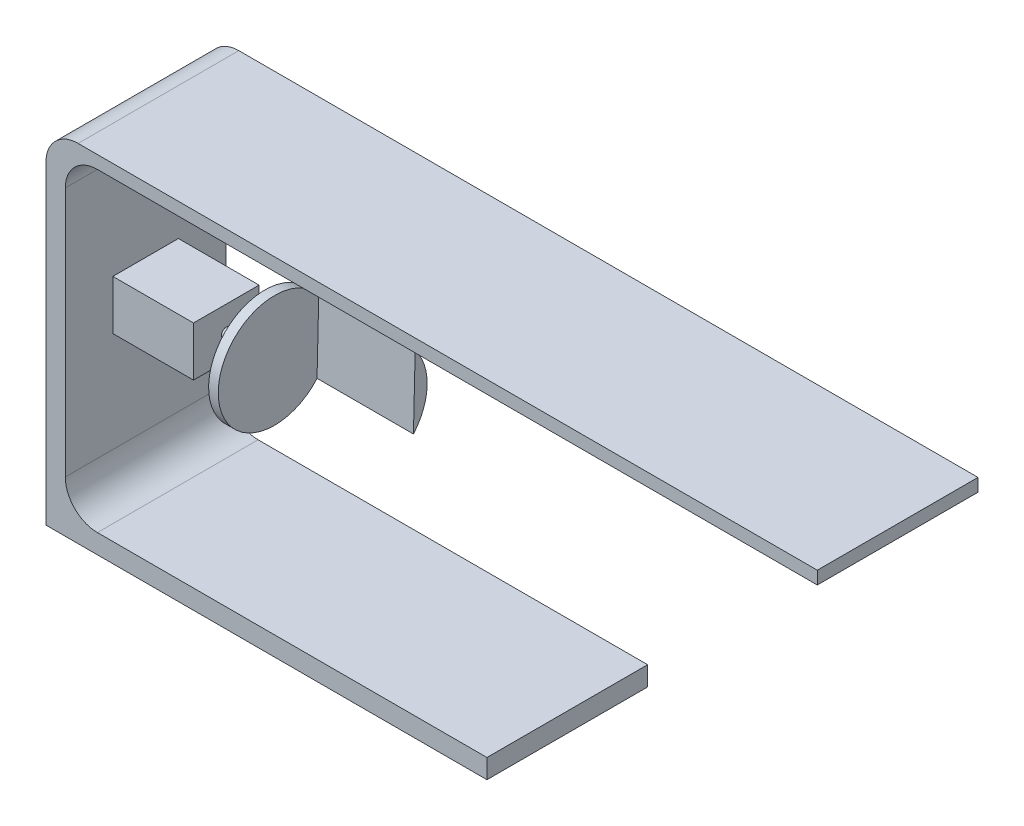
ISO-10303-21;
HEADER;
FILE_DESCRIPTION(('STEP AP214'),'2;1');
FILE_NAME('part.step','',(''),(''),'','','');
FILE_SCHEMA(('AUTOMOTIVE_DESIGN { 1 0 10303 214 1 1 1 1 }'));
ENDSEC;
DATA;
#1=APPLICATION_CONTEXT('core data for automotive mechanical design processes');
#2=APPLICATION_PROTOCOL_DEFINITION('international standard','automotive_design',2000,#1);
#3=PRODUCT_CONTEXT('',#1,'mechanical');
#4=PRODUCT('Part','Part','',(#3));
#5=PRODUCT_RELATED_PRODUCT_CATEGORY('part','',(#4));
#6=PRODUCT_DEFINITION_FORMATION('','',#4);
#7=PRODUCT_DEFINITION_CONTEXT('part definition',#1,'design');
#8=PRODUCT_DEFINITION('design','',#6,#7);
#9=PRODUCT_DEFINITION_SHAPE('','',#8);
#10=(LENGTH_UNIT() NAMED_UNIT(*) SI_UNIT(.MILLI.,.METRE.));
#11=(NAMED_UNIT(*) PLANE_ANGLE_UNIT() SI_UNIT($,.RADIAN.));
#12=(NAMED_UNIT(*) SI_UNIT($,.STERADIAN.) SOLID_ANGLE_UNIT());
#13=UNCERTAINTY_MEASURE_WITH_UNIT(LENGTH_MEASURE(1.E-05),#10,'distance_accuracy_value','');
#14=(GEOMETRIC_REPRESENTATION_CONTEXT(3) GLOBAL_UNCERTAINTY_ASSIGNED_CONTEXT((#13)) GLOBAL_UNIT_ASSIGNED_CONTEXT((#10,
#11,#12)) REPRESENTATION_CONTEXT('',''));
#15=CARTESIAN_POINT('',(0.,0.,0.));
#16=DIRECTION('',(0.,0.,1.));
#17=DIRECTION('',(1.,0.,0.));
#18=AXIS2_PLACEMENT_3D('',#15,#16,#17);
#19=CARTESIAN_POINT('',(-94.1052027599783,-52.9338808323686,0.));
#20=DIRECTION('',(-1.,0.,0.));
#21=DIRECTION('',(0.,0.,1.));
#22=AXIS2_PLACEMENT_3D('',#19,#20,#21);
#23=CYLINDRICAL_SURFACE('',#22,1.5);
#24=CARTESIAN_POINT('',(-94.1052027599783,-52.9338808323686,0.));
#25=DIRECTION('',(1.,0.,0.));
#26=DIRECTION('',(0.,0.,-1.));
#27=AXIS2_PLACEMENT_3D('',#24,#25,#26);
#28=CIRCLE('',#27,1.5);
#29=CARTESIAN_POINT('',(-94.1052027599783,-52.9338808323686,-1.50000000000001));
#30=VERTEX_POINT('',#29);
#31=EDGE_CURVE('E12',#30,#30,#28,.T.);
#32=ORIENTED_EDGE('',*,*,#31,.F.);
#33=EDGE_LOOP('',(#32));
#34=FACE_BOUND('',#33,.T.);
#35=CARTESIAN_POINT('',(-106.105202759978,-52.9338808323686,0.));
#36=DIRECTION('',(1.,0.,0.));
#37=DIRECTION('',(0.,0.,-1.));
#38=AXIS2_PLACEMENT_3D('',#35,#36,#37);
#39=CIRCLE('',#38,1.5);
#40=CARTESIAN_POINT('',(-106.105202759978,-52.9338808323686,-1.50000000000001));
#41=VERTEX_POINT('',#40);
#42=EDGE_CURVE('E59',#41,#41,#39,.T.);
#43=ORIENTED_EDGE('',*,*,#42,.T.);
#44=EDGE_LOOP('',(#43));
#45=FACE_BOUND('',#44,.T.);
#46=ADVANCED_FACE('F56',(#34,#45),#23,.T.);
#47=CARTESIAN_POINT('',(-106.105202759978,-52.9338808323686,0.));
#48=DIRECTION('',(1.,0.,0.));
#49=DIRECTION('',(0.,0.,-1.));
#50=AXIS2_PLACEMENT_3D('',#47,#48,#49);
#51=PLANE('',#50);
#52=ORIENTED_EDGE('',*,*,#42,.F.);
#53=EDGE_LOOP('',(#52));
#54=FACE_BOUND('',#53,.T.);
#55=ADVANCED_FACE('F120',(#54),#51,.F.);
#56=CARTESIAN_POINT('',(-91.1052027599783,-52.9338808323686,0.));
#57=DIRECTION('',(-1.,0.,0.));
#58=DIRECTION('',(0.,0.,1.));
#59=AXIS2_PLACEMENT_3D('',#56,#57,#58);
#60=CYLINDRICAL_SURFACE('',#59,17.5);
#61=CARTESIAN_POINT('',(-91.1052027599783,-52.9338808323686,0.));
#62=DIRECTION('',(1.,0.,0.));
#63=DIRECTION('',(0.,0.,-1.));
#64=AXIS2_PLACEMENT_3D('',#61,#62,#63);
#65=CIRCLE('',#64,17.5);
#66=CARTESIAN_POINT('',(-91.1052027599783,-42.1329352288658,-13.7691529902958));
#67=VERTEX_POINT('',#66);
#68=CARTESIAN_POINT('',(-91.1052027599783,-64.3806688645096,-13.237108587121));
#69=VERTEX_POINT('',#68);
#70=EDGE_CURVE('E81',#67,#69,#65,.T.);
#71=ORIENTED_EDGE('',*,*,#70,.F.);
#72=DIRECTION('',(-1.,0.,0.));
#73=VECTOR('',#72,1.);
#74=CARTESIAN_POINT('',(-61.1052027599783,-42.1329352288658,-13.7691529902958));
#75=LINE('',#74,#73);
#76=CARTESIAN_POINT('',(-61.1052027599783,-42.1329352288658,-13.7691529902958));
#77=VERTEX_POINT('',#76);
#78=EDGE_CURVE('E93',#77,#67,#75,.T.);
#79=ORIENTED_EDGE('',*,*,#78,.F.);
#80=CARTESIAN_POINT('',(-61.1052027599783,-52.9338808323686,0.));
#81=DIRECTION('',(1.,0.,0.));
#82=DIRECTION('',(0.,0.,-1.));
#83=AXIS2_PLACEMENT_3D('',#80,#81,#82);
#84=CIRCLE('',#83,17.5);
#85=CARTESIAN_POINT('',(-61.1052027599783,-64.3806688645096,-13.237108587121));
#86=VERTEX_POINT('',#85);
#87=EDGE_CURVE('E94',#86,#77,#84,.T.);
#88=ORIENTED_EDGE('',*,*,#87,.F.);
#89=DIRECTION('',(-1.,0.,0.));
#90=VECTOR('',#89,1.);
#91=CARTESIAN_POINT('',(-61.1052027599783,-64.3806688645096,-13.237108587121));
#92=LINE('',#91,#90);
#93=EDGE_CURVE('E91',#86,#69,#92,.T.);
#94=ORIENTED_EDGE('',*,*,#93,.T.);
#95=EDGE_LOOP('',(#71,#79,#88,#94));
#96=FACE_BOUND('',#95,.T.);
#97=CARTESIAN_POINT('',(-94.1052027599783,-52.9338808323686,0.));
#98=DIRECTION('',(1.,0.,0.));
#99=DIRECTION('',(0.,0.,-1.));
#100=AXIS2_PLACEMENT_3D('',#97,#98,#99);
#101=CIRCLE('',#100,17.5);
#102=CARTESIAN_POINT('',(-94.1052027599783,-52.9338808323686,-17.5));
#103=VERTEX_POINT('',#102);
#104=EDGE_CURVE('E87',#103,#103,#101,.T.);
#105=ORIENTED_EDGE('',*,*,#104,.T.);
#106=EDGE_LOOP('',(#105));
#107=FACE_BOUND('',#106,.T.);
#108=ADVANCED_FACE('F96',(#96,#107),#60,.T.);
#109=CARTESIAN_POINT('',(-91.1052027599783,-52.9338808323686,0.));
#110=DIRECTION('',(1.,0.,0.));
#111=DIRECTION('',(0.,0.,-1.));
#112=AXIS2_PLACEMENT_3D('',#109,#110,#111);
#113=PLANE('',#112);
#114=DIRECTION('',(0.,-0.999714169889521,0.0239077084243809));
#115=VECTOR('',#114,1.);
#116=CARTESIAN_POINT('',(-91.1052027599783,-42.1329352288658,-13.7691529902958));
#117=LINE('',#116,#115);
#118=EDGE_CURVE('E69',#67,#69,#117,.T.);
#119=ORIENTED_EDGE('',*,*,#118,.F.);
#120=ORIENTED_EDGE('',*,*,#70,.T.);
#121=EDGE_LOOP('',(#119,#120));
#122=FACE_BOUND('',#121,.T.);
#123=ADVANCED_FACE('F82',(#122),#113,.T.);
#124=CARTESIAN_POINT('',(-94.1052027599783,-52.9338808323686,0.));
#125=DIRECTION('',(1.,0.,0.));
#126=DIRECTION('',(0.,0.,-1.));
#127=AXIS2_PLACEMENT_3D('',#124,#125,#126);
#128=PLANE('',#127);
#129=ORIENTED_EDGE('',*,*,#31,.T.);
#130=EDGE_LOOP('',(#129));
#131=FACE_BOUND('',#130,.T.);
#132=ORIENTED_EDGE('',*,*,#104,.F.);
#133=EDGE_LOOP('',(#132));
#134=FACE_BOUND('',#133,.T.);
#135=ADVANCED_FACE('F105',(#131,#134),#128,.F.);
#136=CARTESIAN_POINT('',(-61.1052027599783,-42.1329352288658,-13.7691529902958));
#137=DIRECTION('',(0.,-0.0239077084243809,-0.999714169889521));
#138=DIRECTION('',(0.,0.999714169889521,-0.0239077084243809));
#139=AXIS2_PLACEMENT_3D('',#136,#137,#138);
#140=PLANE('',#139);
#141=ORIENTED_EDGE('',*,*,#118,.T.);
#142=ORIENTED_EDGE('',*,*,#93,.F.);
#143=DIRECTION('',(0.,-0.999714169889521,0.0239077084243809));
#144=VECTOR('',#143,1.);
#145=CARTESIAN_POINT('',(-61.1052027599783,-42.1329352288658,-13.7691529902958));
#146=LINE('',#145,#144);
#147=EDGE_CURVE('E77',#77,#86,#146,.T.);
#148=ORIENTED_EDGE('',*,*,#147,.F.);
#149=ORIENTED_EDGE('',*,*,#78,.T.);
#150=EDGE_LOOP('',(#141,#142,#148,#149));
#151=FACE_BOUND('',#150,.T.);
#152=ADVANCED_FACE('F90',(#151),#140,.F.);
#153=CARTESIAN_POINT('',(-61.1052027599783,-52.9338808323686,0.));
#154=DIRECTION('',(1.,0.,0.));
#155=DIRECTION('',(0.,0.,-1.));
#156=AXIS2_PLACEMENT_3D('',#153,#154,#155);
#157=PLANE('',#156);
#158=ORIENTED_EDGE('',*,*,#87,.T.);
#159=ORIENTED_EDGE('',*,*,#147,.T.);
#160=EDGE_LOOP('',(#158,#159));
#161=FACE_BOUND('',#160,.T.);
#162=ADVANCED_FACE('F114',(#161),#157,.T.);
#163=CLOSED_SHELL('',(#46,#55,#108,#123,#135,#152,#162));
#164=MANIFOLD_SOLID_BREP('B2',#163);
#165=CARTESIAN_POINT('',(-106.105202759978,-60.6338808323686,-10.2));
#166=DIRECTION('',(0.,0.,1.));
#167=DIRECTION('',(1.,0.,0.));
#168=AXIS2_PLACEMENT_3D('',#165,#166,#167);
#169=PLANE('',#168);
#170=DIRECTION('',(0.,1.,0.));
#171=VECTOR('',#170,1.);
#172=CARTESIAN_POINT('',(-131.205202759978,-60.6338808323686,-10.2));
#173=LINE('',#172,#171);
#174=CARTESIAN_POINT('',(-131.205202759978,-60.6338808323686,-10.2));
#175=VERTEX_POINT('',#174);
#176=CARTESIAN_POINT('',(-131.205202759978,-45.2338808323686,-10.2));
#177=VERTEX_POINT('',#176);
#178=EDGE_CURVE('E248',#175,#177,#173,.T.);
#179=ORIENTED_EDGE('',*,*,#178,.T.);
#180=DIRECTION('',(-1.,0.,0.));
#181=VECTOR('',#180,1.);
#182=CARTESIAN_POINT('',(-106.105202759978,-45.2338808323686,-10.2));
#183=LINE('',#182,#181);
#184=CARTESIAN_POINT('',(-106.105202759978,-45.2338808323686,-10.2));
#185=VERTEX_POINT('',#184);
#186=EDGE_CURVE('E54',#185,#177,#183,.T.);
#187=ORIENTED_EDGE('',*,*,#186,.F.);
#188=DIRECTION('',(0.,1.,0.));
#189=VECTOR('',#188,1.);
#190=CARTESIAN_POINT('',(-106.105202759978,-60.6338808323686,-10.2));
#191=LINE('',#190,#189);
#192=CARTESIAN_POINT('',(-106.105202759978,-60.6338808323686,-10.2));
#193=VERTEX_POINT('',#192);
#194=EDGE_CURVE('E236',#193,#185,#191,.T.);
#195=ORIENTED_EDGE('',*,*,#194,.F.);
#196=DIRECTION('',(-1.,0.,0.));
#197=VECTOR('',#196,1.);
#198=CARTESIAN_POINT('',(-106.105202759978,-60.6338808323686,-10.2));
#199=LINE('',#198,#197);
#200=EDGE_CURVE('E244',#193,#175,#199,.T.);
#201=ORIENTED_EDGE('',*,*,#200,.T.);
#202=EDGE_LOOP('',(#179,#187,#195,#201));
#203=FACE_BOUND('',#202,.T.);
#204=ADVANCED_FACE('F185',(#203),#169,.F.);
#205=CARTESIAN_POINT('',(-106.105202759978,-45.2338808323686,10.2));
#206=DIRECTION('',(0.,-1.,0.));
#207=DIRECTION('',(0.,0.,-1.));
#208=AXIS2_PLACEMENT_3D('',#205,#206,#207);
#209=PLANE('',#208);
#210=DIRECTION('',(0.,0.,1.));
#211=VECTOR('',#210,1.);
#212=CARTESIAN_POINT('',(-131.205202759978,-45.2338808323686,10.2));
#213=LINE('',#212,#211);
#214=CARTESIAN_POINT('',(-131.205202759978,-45.2338808323686,10.2));
#215=VERTEX_POINT('',#214);
#216=EDGE_CURVE('E240',#177,#215,#213,.T.);
#217=ORIENTED_EDGE('',*,*,#216,.T.);
#218=DIRECTION('',(-1.,0.,0.));
#219=VECTOR('',#218,1.);
#220=CARTESIAN_POINT('',(-106.105202759978,-45.2338808323686,10.2));
#221=LINE('',#220,#219);
#222=CARTESIAN_POINT('',(-106.105202759978,-45.2338808323686,10.2));
#223=VERTEX_POINT('',#222);
#224=EDGE_CURVE('E193',#223,#215,#221,.T.);
#225=ORIENTED_EDGE('',*,*,#224,.F.);
#226=DIRECTION('',(0.,0.,1.));
#227=VECTOR('',#226,1.);
#228=CARTESIAN_POINT('',(-106.105202759978,-45.2338808323686,10.2));
#229=LINE('',#228,#227);
#230=EDGE_CURVE('E231',#185,#223,#229,.T.);
#231=ORIENTED_EDGE('',*,*,#230,.F.);
#232=ORIENTED_EDGE('',*,*,#186,.T.);
#233=EDGE_LOOP('',(#217,#225,#231,#232));
#234=FACE_BOUND('',#233,.T.);
#235=ADVANCED_FACE('F239',(#234),#209,.F.);
#236=CARTESIAN_POINT('',(-106.105202759978,-60.6338808323686,10.2));
#237=DIRECTION('',(0.,0.,-1.));
#238=DIRECTION('',(-1.,0.,0.));
#239=AXIS2_PLACEMENT_3D('',#236,#237,#238);
#240=PLANE('',#239);
#241=DIRECTION('',(0.,-1.,0.));
#242=VECTOR('',#241,1.);
#243=CARTESIAN_POINT('',(-131.205202759978,-60.6338808323686,10.2));
#244=LINE('',#243,#242);
#245=CARTESIAN_POINT('',(-131.205202759978,-60.6338808323686,10.2));
#246=VERTEX_POINT('',#245);
#247=EDGE_CURVE('E218',#215,#246,#244,.T.);
#248=ORIENTED_EDGE('',*,*,#247,.T.);
#249=DIRECTION('',(-1.,0.,0.));
#250=VECTOR('',#249,1.);
#251=CARTESIAN_POINT('',(-106.105202759978,-60.6338808323686,10.2));
#252=LINE('',#251,#250);
#253=CARTESIAN_POINT('',(-106.105202759978,-60.6338808323686,10.2));
#254=VERTEX_POINT('',#253);
#255=EDGE_CURVE('E241',#254,#246,#252,.T.);
#256=ORIENTED_EDGE('',*,*,#255,.F.);
#257=DIRECTION('',(0.,-1.,0.));
#258=VECTOR('',#257,1.);
#259=CARTESIAN_POINT('',(-106.105202759978,-60.6338808323686,10.2));
#260=LINE('',#259,#258);
#261=EDGE_CURVE('E234',#223,#254,#260,.T.);
#262=ORIENTED_EDGE('',*,*,#261,.F.);
#263=ORIENTED_EDGE('',*,*,#224,.T.);
#264=EDGE_LOOP('',(#248,#256,#262,#263));
#265=FACE_BOUND('',#264,.T.);
#266=ADVANCED_FACE('F242',(#265),#240,.F.);
#267=CARTESIAN_POINT('',(-106.105202759978,-60.6338808323686,10.2));
#268=DIRECTION('',(0.,1.,0.));
#269=DIRECTION('',(0.,0.,1.));
#270=AXIS2_PLACEMENT_3D('',#267,#268,#269);
#271=PLANE('',#270);
#272=DIRECTION('',(0.,0.,-1.));
#273=VECTOR('',#272,1.);
#274=CARTESIAN_POINT('',(-131.205202759978,-60.6338808323686,10.2));
#275=LINE('',#274,#273);
#276=EDGE_CURVE('E224',#246,#175,#275,.T.);
#277=ORIENTED_EDGE('',*,*,#276,.T.);
#278=ORIENTED_EDGE('',*,*,#200,.F.);
#279=DIRECTION('',(0.,0.,-1.));
#280=VECTOR('',#279,1.);
#281=CARTESIAN_POINT('',(-106.105202759978,-60.6338808323686,10.2));
#282=LINE('',#281,#280);
#283=EDGE_CURVE('E201',#254,#193,#282,.T.);
#284=ORIENTED_EDGE('',*,*,#283,.F.);
#285=ORIENTED_EDGE('',*,*,#255,.T.);
#286=EDGE_LOOP('',(#277,#278,#284,#285));
#287=FACE_BOUND('',#286,.T.);
#288=ADVANCED_FACE('F255',(#287),#271,.F.);
#289=CARTESIAN_POINT('',(-106.105202759978,0.,0.));
#290=DIRECTION('',(-1.,0.,0.));
#291=DIRECTION('',(0.,0.,1.));
#292=AXIS2_PLACEMENT_3D('',#289,#290,#291);
#293=PLANE('',#292);
#294=ORIENTED_EDGE('',*,*,#194,.T.);
#295=ORIENTED_EDGE('',*,*,#230,.T.);
#296=ORIENTED_EDGE('',*,*,#261,.T.);
#297=ORIENTED_EDGE('',*,*,#283,.T.);
#298=EDGE_LOOP('',(#294,#295,#296,#297));
#299=FACE_BOUND('',#298,.T.);
#300=ADVANCED_FACE('F232',(#299),#293,.F.);
#301=CARTESIAN_POINT('',(-131.205202759978,0.,0.));
#302=DIRECTION('',(-1.,0.,0.));
#303=DIRECTION('',(0.,0.,1.));
#304=AXIS2_PLACEMENT_3D('',#301,#302,#303);
#305=PLANE('',#304);
#306=ORIENTED_EDGE('',*,*,#178,.F.);
#307=ORIENTED_EDGE('',*,*,#276,.F.);
#308=ORIENTED_EDGE('',*,*,#247,.F.);
#309=ORIENTED_EDGE('',*,*,#216,.F.);
#310=EDGE_LOOP('',(#306,#307,#308,#309));
#311=FACE_BOUND('',#310,.T.);
#312=ADVANCED_FACE('F258',(#311),#305,.T.);
#313=CLOSED_SHELL('',(#204,#235,#266,#288,#300,#312));
#314=MANIFOLD_SOLID_BREP('B6',#313);
#315=CARTESIAN_POINT('',(102.794797240022,0.,-25.));
#316=DIRECTION('',(1.,0.,0.));
#317=DIRECTION('',(0.,0.,-1.));
#318=AXIS2_PLACEMENT_3D('',#315,#316,#317);
#319=PLANE('',#318);
#320=DIRECTION('',(0.,0.,1.));
#321=VECTOR('',#320,1.);
#322=CARTESIAN_POINT('',(102.794797240022,0.,-25.));
#323=LINE('',#322,#321);
#324=CARTESIAN_POINT('',(102.794797240022,0.,-25.));
#325=VERTEX_POINT('',#324);
#326=CARTESIAN_POINT('',(102.794797240022,0.,25.));
#327=VERTEX_POINT('',#326);
#328=EDGE_CURVE('E312',#325,#327,#323,.T.);
#329=ORIENTED_EDGE('',*,*,#328,.T.);
#330=DIRECTION('',(0.,1.,0.));
#331=VECTOR('',#330,1.);
#332=CARTESIAN_POINT('',(102.794797240022,0.,25.));
#333=LINE('',#332,#331);
#334=CARTESIAN_POINT('',(102.794797240022,-4.,25.));
#335=VERTEX_POINT('',#334);
#336=EDGE_CURVE('E392',#335,#327,#333,.T.);
#337=ORIENTED_EDGE('',*,*,#336,.F.);
#338=DIRECTION('',(0.,0.,1.));
#339=VECTOR('',#338,1.);
#340=CARTESIAN_POINT('',(102.794797240022,-4.,-25.));
#341=LINE('',#340,#339);
#342=CARTESIAN_POINT('',(102.794797240022,-4.,-25.));
#343=VERTEX_POINT('',#342);
#344=EDGE_CURVE('E183',#343,#335,#341,.T.);
#345=ORIENTED_EDGE('',*,*,#344,.F.);
#346=DIRECTION('',(0.,1.,0.));
#347=VECTOR('',#346,1.);
#348=CARTESIAN_POINT('',(102.794797240022,0.,-25.));
#349=LINE('',#348,#347);
#350=EDGE_CURVE('E393',#343,#325,#349,.T.);
#351=ORIENTED_EDGE('',*,*,#350,.T.);
#352=EDGE_LOOP('',(#329,#337,#345,#351));
#353=FACE_BOUND('',#352,.T.);
#354=ADVANCED_FACE('F309',(#353),#319,.T.);
#355=CARTESIAN_POINT('',(102.794797240022,-4.,-25.));
#356=DIRECTION('',(0.,-1.,0.));
#357=DIRECTION('',(1.,0.,0.));
#358=AXIS2_PLACEMENT_3D('',#355,#356,#357);
#359=PLANE('',#358);
#360=ORIENTED_EDGE('',*,*,#344,.T.);
#361=DIRECTION('',(1.,0.,0.));
#362=VECTOR('',#361,1.);
#363=CARTESIAN_POINT('',(102.794797240022,-4.,25.));
#364=LINE('',#363,#362);
#365=CARTESIAN_POINT('',(-121.205202759978,-4.00000000000003,25.));
#366=VERTEX_POINT('',#365);
#367=EDGE_CURVE('E412',#366,#335,#364,.T.);
#368=ORIENTED_EDGE('',*,*,#367,.F.);
#369=DIRECTION('',(0.,0.,1.));
#370=VECTOR('',#369,1.);
#371=CARTESIAN_POINT('',(-121.205202759978,-4.00000000000003,-25.));
#372=LINE('',#371,#370);
#373=CARTESIAN_POINT('',(-121.205202759978,-4.00000000000003,-25.));
#374=VERTEX_POINT('',#373);
#375=EDGE_CURVE('E318',#374,#366,#372,.T.);
#376=ORIENTED_EDGE('',*,*,#375,.F.);
#377=DIRECTION('',(1.,0.,0.));
#378=VECTOR('',#377,1.);
#379=CARTESIAN_POINT('',(102.794797240022,-4.,-25.));
#380=LINE('',#379,#378);
#381=EDGE_CURVE('E398',#374,#343,#380,.T.);
#382=ORIENTED_EDGE('',*,*,#381,.T.);
#383=EDGE_LOOP('',(#360,#368,#376,#382));
#384=FACE_BOUND('',#383,.T.);
#385=ADVANCED_FACE('F542',(#384),#359,.T.);
#386=CARTESIAN_POINT('',(-121.205202759978,-14.,-25.));
#387=DIRECTION('',(0.,0.,1.));
#388=DIRECTION('',(1.,0.,0.));
#389=AXIS2_PLACEMENT_3D('',#386,#387,#388);
#390=CYLINDRICAL_SURFACE('',#389,10.);
#391=ORIENTED_EDGE('',*,*,#375,.T.);
#392=CARTESIAN_POINT('',(-121.205202759978,-14.,25.));
#393=DIRECTION('',(0.,0.,-1.));
#394=DIRECTION('',(-1.,0.,0.));
#395=AXIS2_PLACEMENT_3D('',#392,#393,#394);
#396=CIRCLE('',#395,10.);
#397=CARTESIAN_POINT('',(-131.205202759978,-14.0000000000001,25.));
#398=VERTEX_POINT('',#397);
#399=EDGE_CURVE('E442',#398,#366,#396,.T.);
#400=ORIENTED_EDGE('',*,*,#399,.F.);
#401=DIRECTION('',(0.,0.,1.));
#402=VECTOR('',#401,1.);
#403=CARTESIAN_POINT('',(-131.205202759978,-14.0000000000001,-25.));
#404=LINE('',#403,#402);
#405=CARTESIAN_POINT('',(-131.205202759978,-14.0000000000001,-25.));
#406=VERTEX_POINT('',#405);
#407=EDGE_CURVE('E487',#406,#398,#404,.T.);
#408=ORIENTED_EDGE('',*,*,#407,.F.);
#409=CARTESIAN_POINT('',(-121.205202759978,-14.,-25.));
#410=DIRECTION('',(0.,0.,-1.));
#411=DIRECTION('',(-1.,0.,0.));
#412=AXIS2_PLACEMENT_3D('',#409,#410,#411);
#413=CIRCLE('',#412,10.);
#414=EDGE_CURVE('E480',#406,#374,#413,.T.);
#415=ORIENTED_EDGE('',*,*,#414,.T.);
#416=EDGE_LOOP('',(#391,#400,#408,#415));
#417=FACE_BOUND('',#416,.T.);
#418=ADVANCED_FACE('F541',(#417),#390,.F.);
#419=CARTESIAN_POINT('',(-131.205202759978,-14.0000000000001,-25.));
#420=DIRECTION('',(1.,0.,0.));
#421=DIRECTION('',(0.,0.,-1.));
#422=AXIS2_PLACEMENT_3D('',#419,#420,#421);
#423=PLANE('',#422);
#424=ORIENTED_EDGE('',*,*,#407,.T.);
#425=DIRECTION('',(0.,1.,0.));
#426=VECTOR('',#425,1.);
#427=CARTESIAN_POINT('',(-131.205202759978,-14.0000000000001,25.));
#428=LINE('',#427,#426);
#429=CARTESIAN_POINT('',(-131.205202759978,-91.8677616647372,25.));
#430=VERTEX_POINT('',#429);
#431=EDGE_CURVE('E438',#430,#398,#428,.T.);
#432=ORIENTED_EDGE('',*,*,#431,.F.);
#433=DIRECTION('',(0.,0.,1.));
#434=VECTOR('',#433,1.);
#435=CARTESIAN_POINT('',(-131.205202759978,-91.8677616647372,-25.));
#436=LINE('',#435,#434);
#437=CARTESIAN_POINT('',(-131.205202759978,-91.8677616647372,-25.));
#438=VERTEX_POINT('',#437);
#439=EDGE_CURVE('E490',#438,#430,#436,.T.);
#440=ORIENTED_EDGE('',*,*,#439,.F.);
#441=DIRECTION('',(0.,1.,0.));
#442=VECTOR('',#441,1.);
#443=CARTESIAN_POINT('',(-131.205202759978,-14.0000000000001,-25.));
#444=LINE('',#443,#442);
#445=EDGE_CURVE('E476',#438,#406,#444,.T.);
#446=ORIENTED_EDGE('',*,*,#445,.T.);
#447=EDGE_LOOP('',(#424,#432,#440,#446));
#448=FACE_BOUND('',#447,.T.);
#449=ADVANCED_FACE('F537',(#448),#423,.T.);
#450=CARTESIAN_POINT('',(-121.205202759978,-91.8677616647373,-25.));
#451=DIRECTION('',(0.,0.,1.));
#452=DIRECTION('',(1.,0.,0.));
#453=AXIS2_PLACEMENT_3D('',#450,#451,#452);
#454=CYLINDRICAL_SURFACE('',#453,9.99999999999999);
#455=ORIENTED_EDGE('',*,*,#439,.T.);
#456=CARTESIAN_POINT('',(-121.205202759978,-91.8677616647373,25.));
#457=DIRECTION('',(0.,0.,-1.));
#458=DIRECTION('',(1.,0.,0.));
#459=AXIS2_PLACEMENT_3D('',#456,#457,#458);
#460=CIRCLE('',#459,9.99999999999999);
#461=CARTESIAN_POINT('',(-121.205202759978,-101.867761664737,25.));
#462=VERTEX_POINT('',#461);
#463=EDGE_CURVE('E434',#462,#430,#460,.T.);
#464=ORIENTED_EDGE('',*,*,#463,.F.);
#465=DIRECTION('',(0.,0.,1.));
#466=VECTOR('',#465,1.);
#467=CARTESIAN_POINT('',(-121.205202759978,-101.867761664737,-25.));
#468=LINE('',#467,#466);
#469=CARTESIAN_POINT('',(-121.205202759978,-101.867761664737,-25.));
#470=VERTEX_POINT('',#469);
#471=EDGE_CURVE('E493',#470,#462,#468,.T.);
#472=ORIENTED_EDGE('',*,*,#471,.F.);
#473=CARTESIAN_POINT('',(-121.205202759978,-91.8677616647373,-25.));
#474=DIRECTION('',(0.,0.,-1.));
#475=DIRECTION('',(1.,0.,0.));
#476=AXIS2_PLACEMENT_3D('',#473,#474,#475);
#477=CIRCLE('',#476,9.99999999999999);
#478=EDGE_CURVE('E472',#470,#438,#477,.T.);
#479=ORIENTED_EDGE('',*,*,#478,.T.);
#480=EDGE_LOOP('',(#455,#464,#472,#479));
#481=FACE_BOUND('',#480,.T.);
#482=ADVANCED_FACE('F532',(#481),#454,.F.);
#483=CARTESIAN_POINT('',(-121.205202759978,-101.867761664737,-25.));
#484=DIRECTION('',(0.,1.,0.));
#485=DIRECTION('',(0.,0.,1.));
#486=AXIS2_PLACEMENT_3D('',#483,#484,#485);
#487=PLANE('',#486);
#488=ORIENTED_EDGE('',*,*,#471,.T.);
#489=DIRECTION('',(-1.,0.,0.));
#490=VECTOR('',#489,1.);
#491=CARTESIAN_POINT('',(-121.205202759978,-101.867761664737,25.));
#492=LINE('',#491,#490);
#493=CARTESIAN_POINT('',(0.,-101.867761664737,25.));
#494=VERTEX_POINT('',#493);
#495=EDGE_CURVE('E430',#494,#462,#492,.T.);
#496=ORIENTED_EDGE('',*,*,#495,.F.);
#497=DIRECTION('',(0.,0.,1.));
#498=VECTOR('',#497,1.);
#499=CARTESIAN_POINT('',(0.,-101.867761664737,-25.));
#500=LINE('',#499,#498);
#501=CARTESIAN_POINT('',(0.,-101.867761664737,-25.));
#502=VERTEX_POINT('',#501);
#503=EDGE_CURVE('E496',#502,#494,#500,.T.);
#504=ORIENTED_EDGE('',*,*,#503,.F.);
#505=DIRECTION('',(-1.,0.,0.));
#506=VECTOR('',#505,1.);
#507=CARTESIAN_POINT('',(-121.205202759978,-101.867761664737,-25.));
#508=LINE('',#507,#506);
#509=EDGE_CURVE('E468',#502,#470,#508,.T.);
#510=ORIENTED_EDGE('',*,*,#509,.T.);
#511=EDGE_LOOP('',(#488,#496,#504,#510));
#512=FACE_BOUND('',#511,.T.);
#513=ADVANCED_FACE('F530',(#512),#487,.T.);
#514=CARTESIAN_POINT('',(0.,-101.867761664737,-25.));
#515=DIRECTION('',(1.,0.,0.));
#516=DIRECTION('',(0.,1.,0.));
#517=AXIS2_PLACEMENT_3D('',#514,#515,#516);
#518=PLANE('',#517);
#519=ORIENTED_EDGE('',*,*,#503,.T.);
#520=DIRECTION('',(0.,1.,0.));
#521=VECTOR('',#520,1.);
#522=CARTESIAN_POINT('',(0.,-101.867761664737,25.));
#523=LINE('',#522,#521);
#524=CARTESIAN_POINT('',(0.,-107.867761664737,25.));
#525=VERTEX_POINT('',#524);
#526=EDGE_CURVE('E426',#525,#494,#523,.T.);
#527=ORIENTED_EDGE('',*,*,#526,.F.);
#528=DIRECTION('',(0.,0.,1.));
#529=VECTOR('',#528,1.);
#530=CARTESIAN_POINT('',(0.,-107.867761664737,-25.));
#531=LINE('',#530,#529);
#532=CARTESIAN_POINT('',(0.,-107.867761664737,-25.));
#533=VERTEX_POINT('',#532);
#534=EDGE_CURVE('E499',#533,#525,#531,.T.);
#535=ORIENTED_EDGE('',*,*,#534,.F.);
#536=DIRECTION('',(0.,1.,0.));
#537=VECTOR('',#536,1.);
#538=CARTESIAN_POINT('',(0.,-101.867761664737,-25.));
#539=LINE('',#538,#537);
#540=EDGE_CURVE('E464',#533,#502,#539,.T.);
#541=ORIENTED_EDGE('',*,*,#540,.T.);
#542=EDGE_LOOP('',(#519,#527,#535,#541));
#543=FACE_BOUND('',#542,.T.);
#544=ADVANCED_FACE('F525',(#543),#518,.T.);
#545=CARTESIAN_POINT('',(0.,-107.867761664737,-25.));
#546=DIRECTION('',(0.,-1.,0.));
#547=DIRECTION('',(0.,0.,-1.));
#548=AXIS2_PLACEMENT_3D('',#545,#546,#547);
#549=PLANE('',#548);
#550=ORIENTED_EDGE('',*,*,#534,.T.);
#551=DIRECTION('',(1.,0.,0.));
#552=VECTOR('',#551,1.);
#553=CARTESIAN_POINT('',(0.,-107.867761664737,25.));
#554=LINE('',#553,#552);
#555=CARTESIAN_POINT('',(-137.205202759978,-107.867761664737,25.));
#556=VERTEX_POINT('',#555);
#557=EDGE_CURVE('E422',#556,#525,#554,.T.);
#558=ORIENTED_EDGE('',*,*,#557,.F.);
#559=DIRECTION('',(0.,0.,1.));
#560=VECTOR('',#559,1.);
#561=CARTESIAN_POINT('',(-137.205202759978,-107.867761664737,-25.));
#562=LINE('',#561,#560);
#563=CARTESIAN_POINT('',(-137.205202759978,-107.867761664737,-25.));
#564=VERTEX_POINT('',#563);
#565=EDGE_CURVE('E502',#564,#556,#562,.T.);
#566=ORIENTED_EDGE('',*,*,#565,.F.);
#567=DIRECTION('',(1.,0.,0.));
#568=VECTOR('',#567,1.);
#569=CARTESIAN_POINT('',(0.,-107.867761664737,-25.));
#570=LINE('',#569,#568);
#571=EDGE_CURVE('E460',#564,#533,#570,.T.);
#572=ORIENTED_EDGE('',*,*,#571,.T.);
#573=EDGE_LOOP('',(#550,#558,#566,#572));
#574=FACE_BOUND('',#573,.T.);
#575=ADVANCED_FACE('F518',(#574),#549,.T.);
#576=CARTESIAN_POINT('',(-137.205202759978,-107.867761664737,-25.));
#577=DIRECTION('',(-1.,0.,0.));
#578=DIRECTION('',(0.,0.,1.));
#579=AXIS2_PLACEMENT_3D('',#576,#577,#578);
#580=PLANE('',#579);
#581=ORIENTED_EDGE('',*,*,#565,.T.);
#582=DIRECTION('',(0.,-1.,0.));
#583=VECTOR('',#582,1.);
#584=CARTESIAN_POINT('',(-137.205202759978,-107.867761664737,25.));
#585=LINE('',#584,#583);
#586=CARTESIAN_POINT('',(-137.205202759978,-10.0000000000001,25.));
#587=VERTEX_POINT('',#586);
#588=EDGE_CURVE('E418',#587,#556,#585,.T.);
#589=ORIENTED_EDGE('',*,*,#588,.F.);
#590=DIRECTION('',(0.,0.,1.));
#591=VECTOR('',#590,1.);
#592=CARTESIAN_POINT('',(-137.205202759978,-10.0000000000001,-25.));
#593=LINE('',#592,#591);
#594=CARTESIAN_POINT('',(-137.205202759978,-10.0000000000001,-25.));
#595=VERTEX_POINT('',#594);
#596=EDGE_CURVE('E505',#595,#587,#593,.T.);
#597=ORIENTED_EDGE('',*,*,#596,.F.);
#598=DIRECTION('',(0.,-1.,0.));
#599=VECTOR('',#598,1.);
#600=CARTESIAN_POINT('',(-137.205202759978,-107.867761664737,-25.));
#601=LINE('',#600,#599);
#602=EDGE_CURVE('E456',#595,#564,#601,.T.);
#603=ORIENTED_EDGE('',*,*,#602,.T.);
#604=EDGE_LOOP('',(#581,#589,#597,#603));
#605=FACE_BOUND('',#604,.T.);
#606=ADVANCED_FACE('F515',(#605),#580,.T.);
#607=CARTESIAN_POINT('',(-127.205202759978,-10.,-25.));
#608=DIRECTION('',(0.,0.,1.));
#609=DIRECTION('',(1.,0.,0.));
#610=AXIS2_PLACEMENT_3D('',#607,#608,#609);
#611=CYLINDRICAL_SURFACE('',#610,10.);
#612=ORIENTED_EDGE('',*,*,#596,.T.);
#613=CARTESIAN_POINT('',(-127.205202759978,-10.,25.));
#614=DIRECTION('',(0.,0.,1.));
#615=DIRECTION('',(1.,0.,0.));
#616=AXIS2_PLACEMENT_3D('',#613,#614,#615);
#617=CIRCLE('',#616,10.);
#618=CARTESIAN_POINT('',(-127.205202759978,0.,25.));
#619=VERTEX_POINT('',#618);
#620=EDGE_CURVE('E407',#619,#587,#617,.T.);
#621=ORIENTED_EDGE('',*,*,#620,.F.);
#622=DIRECTION('',(0.,0.,1.));
#623=VECTOR('',#622,1.);
#624=CARTESIAN_POINT('',(-127.205202759978,0.,-25.));
#625=LINE('',#624,#623);
#626=CARTESIAN_POINT('',(-127.205202759978,0.,-25.));
#627=VERTEX_POINT('',#626);
#628=EDGE_CURVE('E397',#627,#619,#625,.T.);
#629=ORIENTED_EDGE('',*,*,#628,.F.);
#630=CARTESIAN_POINT('',(-127.205202759978,-10.,-25.));
#631=DIRECTION('',(0.,0.,1.));
#632=DIRECTION('',(1.,0.,0.));
#633=AXIS2_PLACEMENT_3D('',#630,#631,#632);
#634=CIRCLE('',#633,10.);
#635=EDGE_CURVE('E452',#627,#595,#634,.T.);
#636=ORIENTED_EDGE('',*,*,#635,.T.);
#637=EDGE_LOOP('',(#612,#621,#629,#636));
#638=FACE_BOUND('',#637,.T.);
#639=ADVANCED_FACE('F509',(#638),#611,.T.);
#640=CARTESIAN_POINT('',(-127.205202759978,0.,-25.));
#641=DIRECTION('',(0.,1.,0.));
#642=DIRECTION('',(-1.,0.,0.));
#643=AXIS2_PLACEMENT_3D('',#640,#641,#642);
#644=PLANE('',#643);
#645=ORIENTED_EDGE('',*,*,#628,.T.);
#646=DIRECTION('',(-1.,0.,0.));
#647=VECTOR('',#646,1.);
#648=CARTESIAN_POINT('',(-102.794797240022,0.,25.));
#649=LINE('',#648,#647);
#650=EDGE_CURVE('E400',#327,#619,#649,.T.);
#651=ORIENTED_EDGE('',*,*,#650,.F.);
#652=ORIENTED_EDGE('',*,*,#328,.F.);
#653=DIRECTION('',(-1.,0.,0.));
#654=VECTOR('',#653,1.);
#655=CARTESIAN_POINT('',(-102.794797240022,0.,-25.));
#656=LINE('',#655,#654);
#657=EDGE_CURVE('E449',#325,#627,#656,.T.);
#658=ORIENTED_EDGE('',*,*,#657,.T.);
#659=EDGE_LOOP('',(#645,#651,#652,#658));
#660=FACE_BOUND('',#659,.T.);
#661=ADVANCED_FACE('F401',(#660),#644,.T.);
#662=CARTESIAN_POINT('',(-121.205202759978,-14.,-25.));
#663=DIRECTION('',(0.,0.,-1.));
#664=DIRECTION('',(-1.,0.,0.));
#665=AXIS2_PLACEMENT_3D('',#662,#663,#664);
#666=PLANE('',#665);
#667=ORIENTED_EDGE('',*,*,#350,.F.);
#668=ORIENTED_EDGE('',*,*,#381,.F.);
#669=ORIENTED_EDGE('',*,*,#414,.F.);
#670=ORIENTED_EDGE('',*,*,#445,.F.);
#671=ORIENTED_EDGE('',*,*,#478,.F.);
#672=ORIENTED_EDGE('',*,*,#509,.F.);
#673=ORIENTED_EDGE('',*,*,#540,.F.);
#674=ORIENTED_EDGE('',*,*,#571,.F.);
#675=ORIENTED_EDGE('',*,*,#602,.F.);
#676=ORIENTED_EDGE('',*,*,#635,.F.);
#677=ORIENTED_EDGE('',*,*,#657,.F.);
#678=EDGE_LOOP('',(#667,#668,#669,#670,#671,#672,#673,#674,#675,#676,#677));
#679=FACE_BOUND('',#678,.T.);
#680=ADVANCED_FACE('F521',(#679),#666,.T.);
#681=CARTESIAN_POINT('',(-121.205202759978,-14.,25.));
#682=DIRECTION('',(0.,0.,-1.));
#683=DIRECTION('',(-1.,0.,0.));
#684=AXIS2_PLACEMENT_3D('',#681,#682,#683);
#685=PLANE('',#684);
#686=ORIENTED_EDGE('',*,*,#336,.T.);
#687=ORIENTED_EDGE('',*,*,#650,.T.);
#688=ORIENTED_EDGE('',*,*,#620,.T.);
#689=ORIENTED_EDGE('',*,*,#588,.T.);
#690=ORIENTED_EDGE('',*,*,#557,.T.);
#691=ORIENTED_EDGE('',*,*,#526,.T.);
#692=ORIENTED_EDGE('',*,*,#495,.T.);
#693=ORIENTED_EDGE('',*,*,#463,.T.);
#694=ORIENTED_EDGE('',*,*,#431,.T.);
#695=ORIENTED_EDGE('',*,*,#399,.T.);
#696=ORIENTED_EDGE('',*,*,#367,.T.);
#697=EDGE_LOOP('',(#686,#687,#688,#689,#690,#691,#692,#693,#694,#695,#696));
#698=FACE_BOUND('',#697,.T.);
#699=ADVANCED_FACE('F410',(#698),#685,.F.);
#700=CLOSED_SHELL('',(#354,#385,#418,#449,#482,#513,#544,#575,#606,#639,#661,#680,#699));
#701=MANIFOLD_SOLID_BREP('B48',#700);
#702=ADVANCED_BREP_SHAPE_REPRESENTATION('',(#18,#164,#314,#701),#14);
#703=SHAPE_DEFINITION_REPRESENTATION(#9,#702);
ENDSEC;
END-ISO-10303-21;
